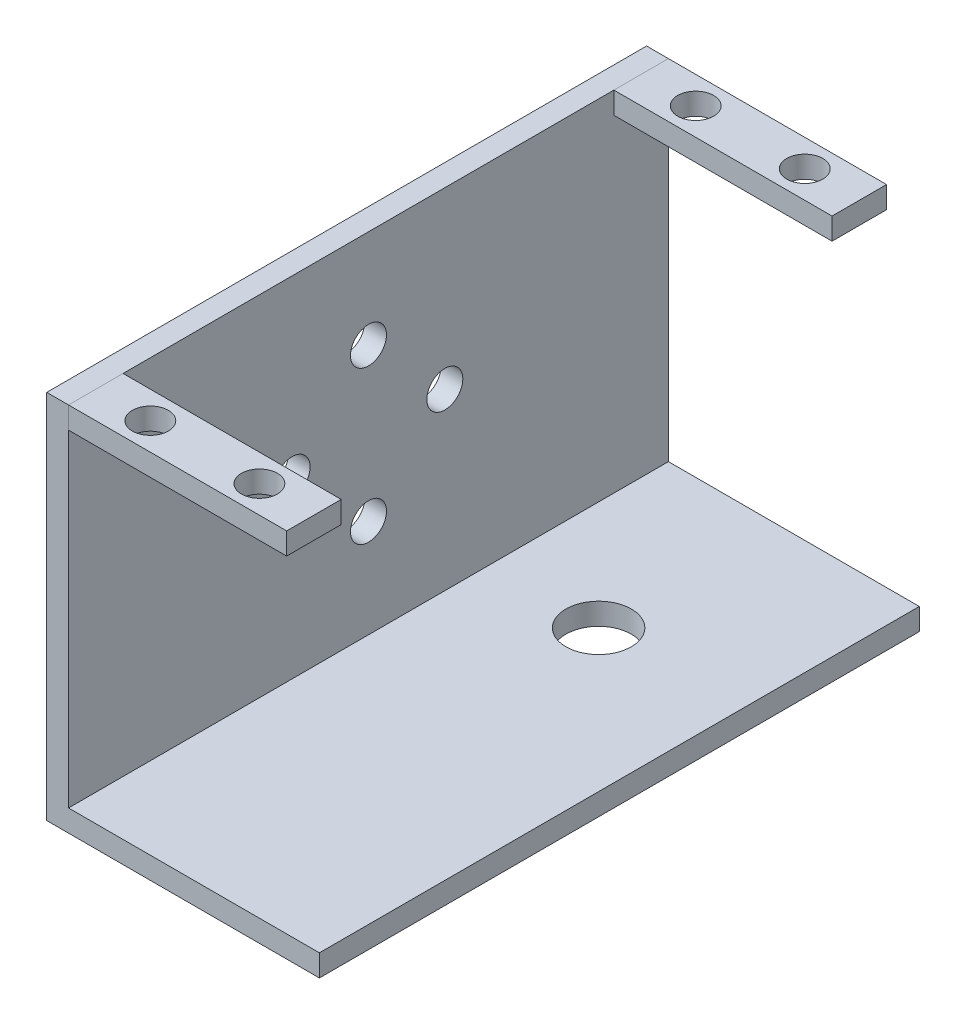
ISO-10303-21;
HEADER;
FILE_DESCRIPTION(('STEP AP214'),'2;1');
FILE_NAME('part.step','',(''),(''),'','','');
FILE_SCHEMA(('AUTOMOTIVE_DESIGN { 1 0 10303 214 1 1 1 1 }'));
ENDSEC;
DATA;
#1=APPLICATION_CONTEXT('core data for automotive mechanical design processes');
#2=APPLICATION_PROTOCOL_DEFINITION('international standard','automotive_design',2000,#1);
#3=PRODUCT_CONTEXT('',#1,'mechanical');
#4=PRODUCT('Part','Part','',(#3));
#5=PRODUCT_RELATED_PRODUCT_CATEGORY('part','',(#4));
#6=PRODUCT_DEFINITION_FORMATION('','',#4);
#7=PRODUCT_DEFINITION_CONTEXT('part definition',#1,'design');
#8=PRODUCT_DEFINITION('design','',#6,#7);
#9=PRODUCT_DEFINITION_SHAPE('','',#8);
#10=(LENGTH_UNIT() NAMED_UNIT(*) SI_UNIT(.MILLI.,.METRE.));
#11=(NAMED_UNIT(*) PLANE_ANGLE_UNIT() SI_UNIT($,.RADIAN.));
#12=(NAMED_UNIT(*) SI_UNIT($,.STERADIAN.) SOLID_ANGLE_UNIT());
#13=UNCERTAINTY_MEASURE_WITH_UNIT(LENGTH_MEASURE(1.E-05),#10,'distance_accuracy_value','');
#14=(GEOMETRIC_REPRESENTATION_CONTEXT(3) GLOBAL_UNCERTAINTY_ASSIGNED_CONTEXT((#13)) GLOBAL_UNIT_ASSIGNED_CONTEXT((#10,
#11,#12)) REPRESENTATION_CONTEXT('',''));
#15=CARTESIAN_POINT('',(0.,0.,0.));
#16=DIRECTION('',(0.,0.,1.));
#17=DIRECTION('',(1.,0.,0.));
#18=AXIS2_PLACEMENT_3D('',#15,#16,#17);
#19=CARTESIAN_POINT('',(9.49999999999993,32.,-22.5));
#20=DIRECTION('',(0.,0.,-1.));
#21=DIRECTION('',(0.,1.,0.));
#22=AXIS2_PLACEMENT_3D('',#19,#20,#21);
#23=PLANE('',#22);
#24=DIRECTION('',(0.,-1.,0.));
#25=VECTOR('',#24,1.);
#26=CARTESIAN_POINT('',(-10.5000000000001,32.,-22.5));
#27=LINE('',#26,#25);
#28=CARTESIAN_POINT('',(-10.5,34.,-22.5));
#29=VERTEX_POINT('',#28);
#30=CARTESIAN_POINT('',(-10.5000000000001,32.,-22.5));
#31=VERTEX_POINT('',#30);
#32=EDGE_CURVE('E122',#29,#31,#27,.T.);
#33=ORIENTED_EDGE('',*,*,#32,.T.);
#34=DIRECTION('',(-1.,0.,0.));
#35=VECTOR('',#34,1.);
#36=CARTESIAN_POINT('',(9.49999999999993,32.,-22.5));
#37=LINE('',#36,#35);
#38=CARTESIAN_POINT('',(9.49999999999993,32.,-22.5));
#39=VERTEX_POINT('',#38);
#40=EDGE_CURVE('E12',#39,#31,#37,.T.);
#41=ORIENTED_EDGE('',*,*,#40,.F.);
#42=DIRECTION('',(0.,-1.,0.));
#43=VECTOR('',#42,1.);
#44=CARTESIAN_POINT('',(9.49999999999993,32.,-22.5));
#45=LINE('',#44,#43);
#46=CARTESIAN_POINT('',(9.49999999999999,34.0000000000002,-22.5));
#47=VERTEX_POINT('',#46);
#48=EDGE_CURVE('E105',#47,#39,#45,.T.);
#49=ORIENTED_EDGE('',*,*,#48,.F.);
#50=DIRECTION('',(-1.,0.,0.));
#51=VECTOR('',#50,1.);
#52=CARTESIAN_POINT('',(9.49999999999999,34.0000000000002,-22.5));
#53=LINE('',#52,#51);
#54=EDGE_CURVE('E118',#47,#29,#53,.T.);
#55=ORIENTED_EDGE('',*,*,#54,.T.);
#56=EDGE_LOOP('',(#33,#41,#49,#55));
#57=FACE_BOUND('',#56,.T.);
#58=ADVANCED_FACE('F53',(#57),#23,.F.);
#59=CARTESIAN_POINT('',(9.49999999999993,32.,-22.5));
#60=DIRECTION('',(0.,1.,0.));
#61=DIRECTION('',(0.,0.,1.));
#62=AXIS2_PLACEMENT_3D('',#59,#60,#61);
#63=PLANE('',#62);
#64=CARTESIAN_POINT('',(4.49999999999993,32.,-25.));
#65=DIRECTION('',(0.,1.,0.));
#66=DIRECTION('',(0.,0.,1.));
#67=AXIS2_PLACEMENT_3D('',#64,#65,#66);
#68=CIRCLE('',#67,1.65);
#69=CARTESIAN_POINT('',(4.49999999999993,32.,-23.35));
#70=VERTEX_POINT('',#69);
#71=EDGE_CURVE('E126',#70,#70,#68,.F.);
#72=ORIENTED_EDGE('',*,*,#71,.F.);
#73=EDGE_LOOP('',(#72));
#74=FACE_BOUND('',#73,.T.);
#75=CARTESIAN_POINT('',(-5.50000000000007,32.,-25.));
#76=DIRECTION('',(0.,1.,0.));
#77=DIRECTION('',(0.,0.,1.));
#78=AXIS2_PLACEMENT_3D('',#75,#76,#77);
#79=CIRCLE('',#78,1.65);
#80=CARTESIAN_POINT('',(-5.50000000000007,32.,-23.35));
#81=VERTEX_POINT('',#80);
#82=EDGE_CURVE('E145',#81,#81,#79,.F.);
#83=ORIENTED_EDGE('',*,*,#82,.F.);
#84=EDGE_LOOP('',(#83));
#85=FACE_BOUND('',#84,.T.);
#86=DIRECTION('',(0.,0.,-1.));
#87=VECTOR('',#86,1.);
#88=CARTESIAN_POINT('',(-10.5000000000001,32.,-22.5));
#89=LINE('',#88,#87);
#90=CARTESIAN_POINT('',(-10.5,32.,-27.5));
#91=VERTEX_POINT('',#90);
#92=EDGE_CURVE('E110',#31,#91,#89,.T.);
#93=ORIENTED_EDGE('',*,*,#92,.T.);
#94=DIRECTION('',(-1.,0.,0.));
#95=VECTOR('',#94,1.);
#96=CARTESIAN_POINT('',(9.5,32.,-27.5));
#97=LINE('',#96,#95);
#98=CARTESIAN_POINT('',(9.5,32.,-27.5));
#99=VERTEX_POINT('',#98);
#100=EDGE_CURVE('E62',#99,#91,#97,.T.);
#101=ORIENTED_EDGE('',*,*,#100,.F.);
#102=DIRECTION('',(0.,0.,-1.));
#103=VECTOR('',#102,1.);
#104=CARTESIAN_POINT('',(9.49999999999993,32.,-22.5));
#105=LINE('',#104,#103);
#106=EDGE_CURVE('E100',#39,#99,#105,.T.);
#107=ORIENTED_EDGE('',*,*,#106,.F.);
#108=ORIENTED_EDGE('',*,*,#40,.T.);
#109=EDGE_LOOP('',(#93,#101,#107,#108));
#110=FACE_BOUND('',#109,.T.);
#111=ADVANCED_FACE('F109',(#74,#85,#110),#63,.F.);
#112=CARTESIAN_POINT('',(9.5,32.,-27.5));
#113=DIRECTION('',(0.,0.,1.));
#114=DIRECTION('',(1.,0.,0.));
#115=AXIS2_PLACEMENT_3D('',#112,#113,#114);
#116=PLANE('',#115);
#117=DIRECTION('',(0.,1.,0.));
#118=VECTOR('',#117,1.);
#119=CARTESIAN_POINT('',(-10.5,32.,-27.5));
#120=LINE('',#119,#118);
#121=CARTESIAN_POINT('',(-10.5,34.,-27.5));
#122=VERTEX_POINT('',#121);
#123=EDGE_CURVE('E87',#91,#122,#120,.T.);
#124=ORIENTED_EDGE('',*,*,#123,.T.);
#125=DIRECTION('',(-1.,0.,0.));
#126=VECTOR('',#125,1.);
#127=CARTESIAN_POINT('',(9.5,34.,-27.5));
#128=LINE('',#127,#126);
#129=CARTESIAN_POINT('',(9.5,34.,-27.5));
#130=VERTEX_POINT('',#129);
#131=EDGE_CURVE('E112',#130,#122,#128,.T.);
#132=ORIENTED_EDGE('',*,*,#131,.F.);
#133=DIRECTION('',(0.,1.,0.));
#134=VECTOR('',#133,1.);
#135=CARTESIAN_POINT('',(9.5,32.,-27.5));
#136=LINE('',#135,#134);
#137=EDGE_CURVE('E103',#99,#130,#136,.T.);
#138=ORIENTED_EDGE('',*,*,#137,.F.);
#139=ORIENTED_EDGE('',*,*,#100,.T.);
#140=EDGE_LOOP('',(#124,#132,#138,#139));
#141=FACE_BOUND('',#140,.T.);
#142=ADVANCED_FACE('F113',(#141),#116,.F.);
#143=CARTESIAN_POINT('',(9.49999999999999,34.0000000000002,-22.5));
#144=DIRECTION('',(0.,-1.,0.));
#145=DIRECTION('',(0.,0.,-1.));
#146=AXIS2_PLACEMENT_3D('',#143,#144,#145);
#147=PLANE('',#146);
#148=CARTESIAN_POINT('',(4.5,34.,-25.));
#149=DIRECTION('',(0.,1.,0.));
#150=DIRECTION('',(0.,0.,-1.));
#151=AXIS2_PLACEMENT_3D('',#148,#149,#150);
#152=CIRCLE('',#151,1.65);
#153=CARTESIAN_POINT('',(4.5,34.,-26.65));
#154=VERTEX_POINT('',#153);
#155=EDGE_CURVE('E149',#154,#154,#152,.T.);
#156=ORIENTED_EDGE('',*,*,#155,.F.);
#157=EDGE_LOOP('',(#156));
#158=FACE_BOUND('',#157,.T.);
#159=CARTESIAN_POINT('',(-5.5,34.,-25.));
#160=DIRECTION('',(0.,1.,0.));
#161=DIRECTION('',(0.,0.,-1.));
#162=AXIS2_PLACEMENT_3D('',#159,#160,#161);
#163=CIRCLE('',#162,1.65);
#164=CARTESIAN_POINT('',(-5.5,34.,-26.65));
#165=VERTEX_POINT('',#164);
#166=EDGE_CURVE('E150',#165,#165,#163,.T.);
#167=ORIENTED_EDGE('',*,*,#166,.F.);
#168=EDGE_LOOP('',(#167));
#169=FACE_BOUND('',#168,.T.);
#170=DIRECTION('',(0.,0.,1.));
#171=VECTOR('',#170,1.);
#172=CARTESIAN_POINT('',(-10.5,34.,-22.5));
#173=LINE('',#172,#171);
#174=EDGE_CURVE('E93',#122,#29,#173,.T.);
#175=ORIENTED_EDGE('',*,*,#174,.T.);
#176=ORIENTED_EDGE('',*,*,#54,.F.);
#177=DIRECTION('',(0.,0.,1.));
#178=VECTOR('',#177,1.);
#179=CARTESIAN_POINT('',(9.49999999999999,34.0000000000002,-22.5));
#180=LINE('',#179,#178);
#181=EDGE_CURVE('E70',#130,#47,#180,.T.);
#182=ORIENTED_EDGE('',*,*,#181,.F.);
#183=ORIENTED_EDGE('',*,*,#131,.T.);
#184=EDGE_LOOP('',(#175,#176,#182,#183));
#185=FACE_BOUND('',#184,.T.);
#186=ADVANCED_FACE('F137',(#158,#169,#185),#147,.F.);
#187=CARTESIAN_POINT('',(9.5,0.,0.));
#188=DIRECTION('',(-1.,0.,0.));
#189=DIRECTION('',(0.,0.,1.));
#190=AXIS2_PLACEMENT_3D('',#187,#188,#189);
#191=PLANE('',#190);
#192=ORIENTED_EDGE('',*,*,#48,.T.);
#193=ORIENTED_EDGE('',*,*,#106,.T.);
#194=ORIENTED_EDGE('',*,*,#137,.T.);
#195=ORIENTED_EDGE('',*,*,#181,.T.);
#196=EDGE_LOOP('',(#192,#193,#194,#195));
#197=FACE_BOUND('',#196,.T.);
#198=ADVANCED_FACE('F101',(#197),#191,.F.);
#199=CARTESIAN_POINT('',(-10.5,0.,0.));
#200=DIRECTION('',(-1.,0.,0.));
#201=DIRECTION('',(0.,0.,1.));
#202=AXIS2_PLACEMENT_3D('',#199,#200,#201);
#203=PLANE('',#202);
#204=ORIENTED_EDGE('',*,*,#32,.F.);
#205=ORIENTED_EDGE('',*,*,#174,.F.);
#206=ORIENTED_EDGE('',*,*,#123,.F.);
#207=ORIENTED_EDGE('',*,*,#92,.F.);
#208=EDGE_LOOP('',(#204,#205,#206,#207));
#209=FACE_BOUND('',#208,.T.);
#210=ADVANCED_FACE('F140',(#209),#203,.T.);
#211=CARTESIAN_POINT('',(-5.5,-0.000999999999924672,-25.));
#212=DIRECTION('',(0.,1.,0.));
#213=DIRECTION('',(0.,0.,1.));
#214=AXIS2_PLACEMENT_3D('',#211,#212,#213);
#215=CYLINDRICAL_SURFACE('',#214,1.65);
#216=ORIENTED_EDGE('',*,*,#166,.T.);
#217=EDGE_LOOP('',(#216));
#218=FACE_BOUND('',#217,.T.);
#219=ORIENTED_EDGE('',*,*,#82,.T.);
#220=EDGE_LOOP('',(#219));
#221=FACE_BOUND('',#220,.T.);
#222=ADVANCED_FACE('F170',(#218,#221),#215,.F.);
#223=CARTESIAN_POINT('',(4.5,-0.000999999999924672,-25.));
#224=DIRECTION('',(0.,1.,0.));
#225=DIRECTION('',(0.,0.,1.));
#226=AXIS2_PLACEMENT_3D('',#223,#224,#225);
#227=CYLINDRICAL_SURFACE('',#226,1.65);
#228=ORIENTED_EDGE('',*,*,#155,.T.);
#229=EDGE_LOOP('',(#228));
#230=FACE_BOUND('',#229,.T.);
#231=ORIENTED_EDGE('',*,*,#71,.T.);
#232=EDGE_LOOP('',(#231));
#233=FACE_BOUND('',#232,.T.);
#234=ADVANCED_FACE('F162',(#230,#233),#227,.F.);
#235=CLOSED_SHELL('',(#58,#111,#142,#186,#198,#210,#222,#234));
#236=MANIFOLD_SOLID_BREP('B2',#235);
#237=CARTESIAN_POINT('',(9.49999999999993,32.,22.4999999999999));
#238=DIRECTION('',(0.,0.,1.));
#239=DIRECTION('',(1.,0.,0.));
#240=AXIS2_PLACEMENT_3D('',#237,#238,#239);
#241=PLANE('',#240);
#242=DIRECTION('',(0.,1.,0.));
#243=VECTOR('',#242,1.);
#244=CARTESIAN_POINT('',(-10.5000000000001,32.,22.5));
#245=LINE('',#244,#243);
#246=CARTESIAN_POINT('',(-10.5000000000001,32.,22.5));
#247=VERTEX_POINT('',#246);
#248=CARTESIAN_POINT('',(-10.5,34.,22.5));
#249=VERTEX_POINT('',#248);
#250=EDGE_CURVE('E344',#247,#249,#245,.T.);
#251=ORIENTED_EDGE('',*,*,#250,.T.);
#252=DIRECTION('',(-1.,0.,0.));
#253=VECTOR('',#252,1.);
#254=CARTESIAN_POINT('',(9.5,34.,22.5));
#255=LINE('',#254,#253);
#256=CARTESIAN_POINT('',(9.5,34.,22.5));
#257=VERTEX_POINT('',#256);
#258=EDGE_CURVE('E51',#257,#249,#255,.T.);
#259=ORIENTED_EDGE('',*,*,#258,.F.);
#260=DIRECTION('',(0.,1.,0.));
#261=VECTOR('',#260,1.);
#262=CARTESIAN_POINT('',(9.49999999999993,32.,22.4999999999999));
#263=LINE('',#262,#261);
#264=CARTESIAN_POINT('',(9.49999999999993,32.,22.4999999999999));
#265=VERTEX_POINT('',#264);
#266=EDGE_CURVE('E327',#265,#257,#263,.T.);
#267=ORIENTED_EDGE('',*,*,#266,.F.);
#268=DIRECTION('',(-1.,0.,0.));
#269=VECTOR('',#268,1.);
#270=CARTESIAN_POINT('',(9.49999999999993,32.,22.4999999999999));
#271=LINE('',#270,#269);
#272=EDGE_CURVE('E340',#265,#247,#271,.T.);
#273=ORIENTED_EDGE('',*,*,#272,.T.);
#274=EDGE_LOOP('',(#251,#259,#267,#273));
#275=FACE_BOUND('',#274,.T.);
#276=ADVANCED_FACE('F275',(#275),#241,.F.);
#277=CARTESIAN_POINT('',(9.5,34.,22.5));
#278=DIRECTION('',(0.,-1.,0.));
#279=DIRECTION('',(0.,0.,-1.));
#280=AXIS2_PLACEMENT_3D('',#277,#278,#279);
#281=PLANE('',#280);
#282=CARTESIAN_POINT('',(-5.5,34.,25.));
#283=DIRECTION('',(0.,1.,0.));
#284=DIRECTION('',(0.,0.,1.));
#285=AXIS2_PLACEMENT_3D('',#282,#283,#284);
#286=CIRCLE('',#285,1.65);
#287=CARTESIAN_POINT('',(-5.5,34.,26.65));
#288=VERTEX_POINT('',#287);
#289=EDGE_CURVE('E371',#288,#288,#286,.T.);
#290=ORIENTED_EDGE('',*,*,#289,.F.);
#291=EDGE_LOOP('',(#290));
#292=FACE_BOUND('',#291,.T.);
#293=CARTESIAN_POINT('',(4.5,34.,25.));
#294=DIRECTION('',(0.,1.,0.));
#295=DIRECTION('',(0.,0.,1.));
#296=AXIS2_PLACEMENT_3D('',#293,#294,#295);
#297=CIRCLE('',#296,1.65);
#298=CARTESIAN_POINT('',(4.5,34.,26.65));
#299=VERTEX_POINT('',#298);
#300=EDGE_CURVE('E372',#299,#299,#297,.T.);
#301=ORIENTED_EDGE('',*,*,#300,.F.);
#302=EDGE_LOOP('',(#301));
#303=FACE_BOUND('',#302,.T.);
#304=DIRECTION('',(0.,0.,1.));
#305=VECTOR('',#304,1.);
#306=CARTESIAN_POINT('',(-10.5,34.,22.5));
#307=LINE('',#306,#305);
#308=CARTESIAN_POINT('',(-10.5,34.,27.5));
#309=VERTEX_POINT('',#308);
#310=EDGE_CURVE('E332',#249,#309,#307,.T.);
#311=ORIENTED_EDGE('',*,*,#310,.T.);
#312=DIRECTION('',(-1.,0.,0.));
#313=VECTOR('',#312,1.);
#314=CARTESIAN_POINT('',(9.50000000000001,34.,27.5));
#315=LINE('',#314,#313);
#316=CARTESIAN_POINT('',(9.50000000000001,34.,27.5));
#317=VERTEX_POINT('',#316);
#318=EDGE_CURVE('E284',#317,#309,#315,.T.);
#319=ORIENTED_EDGE('',*,*,#318,.F.);
#320=DIRECTION('',(0.,0.,1.));
#321=VECTOR('',#320,1.);
#322=CARTESIAN_POINT('',(9.5,34.,22.5));
#323=LINE('',#322,#321);
#324=EDGE_CURVE('E322',#257,#317,#323,.T.);
#325=ORIENTED_EDGE('',*,*,#324,.F.);
#326=ORIENTED_EDGE('',*,*,#258,.T.);
#327=EDGE_LOOP('',(#311,#319,#325,#326));
#328=FACE_BOUND('',#327,.T.);
#329=ADVANCED_FACE('F331',(#292,#303,#328),#281,.F.);
#330=CARTESIAN_POINT('',(9.5,32.0000000000001,27.5));
#331=DIRECTION('',(0.,0.,-1.));
#332=DIRECTION('',(-1.,0.,0.));
#333=AXIS2_PLACEMENT_3D('',#330,#331,#332);
#334=PLANE('',#333);
#335=DIRECTION('',(0.,-1.,0.));
#336=VECTOR('',#335,1.);
#337=CARTESIAN_POINT('',(-10.5,32.,27.5));
#338=LINE('',#337,#336);
#339=CARTESIAN_POINT('',(-10.5,32.,27.5));
#340=VERTEX_POINT('',#339);
#341=EDGE_CURVE('E309',#309,#340,#338,.T.);
#342=ORIENTED_EDGE('',*,*,#341,.T.);
#343=DIRECTION('',(-1.,0.,0.));
#344=VECTOR('',#343,1.);
#345=CARTESIAN_POINT('',(9.5,32.0000000000001,27.5));
#346=LINE('',#345,#344);
#347=CARTESIAN_POINT('',(9.5,32.0000000000001,27.5));
#348=VERTEX_POINT('',#347);
#349=EDGE_CURVE('E334',#348,#340,#346,.T.);
#350=ORIENTED_EDGE('',*,*,#349,.F.);
#351=DIRECTION('',(0.,-1.,0.));
#352=VECTOR('',#351,1.);
#353=CARTESIAN_POINT('',(9.5,32.0000000000001,27.5));
#354=LINE('',#353,#352);
#355=EDGE_CURVE('E325',#317,#348,#354,.T.);
#356=ORIENTED_EDGE('',*,*,#355,.F.);
#357=ORIENTED_EDGE('',*,*,#318,.T.);
#358=EDGE_LOOP('',(#342,#350,#356,#357));
#359=FACE_BOUND('',#358,.T.);
#360=ADVANCED_FACE('F335',(#359),#334,.F.);
#361=CARTESIAN_POINT('',(9.49999999999993,32.,22.4999999999999));
#362=DIRECTION('',(0.,1.,0.));
#363=DIRECTION('',(0.,0.,1.));
#364=AXIS2_PLACEMENT_3D('',#361,#362,#363);
#365=PLANE('',#364);
#366=CARTESIAN_POINT('',(-5.5,32.0000000000002,25.));
#367=DIRECTION('',(0.,1.,0.));
#368=DIRECTION('',(0.,0.,1.));
#369=AXIS2_PLACEMENT_3D('',#366,#367,#368);
#370=CIRCLE('',#369,1.65);
#371=CARTESIAN_POINT('',(-5.5,32.0000000000002,26.65));
#372=VERTEX_POINT('',#371);
#373=EDGE_CURVE('E348',#372,#372,#370,.F.);
#374=ORIENTED_EDGE('',*,*,#373,.F.);
#375=EDGE_LOOP('',(#374));
#376=FACE_BOUND('',#375,.T.);
#377=CARTESIAN_POINT('',(4.5,32.0000000000001,24.9999999999999));
#378=DIRECTION('',(0.,1.,0.));
#379=DIRECTION('',(0.,0.,1.));
#380=AXIS2_PLACEMENT_3D('',#377,#378,#379);
#381=CIRCLE('',#380,1.65);
#382=CARTESIAN_POINT('',(4.5,32.0000000000001,26.6499999999999));
#383=VERTEX_POINT('',#382);
#384=EDGE_CURVE('E367',#383,#383,#381,.F.);
#385=ORIENTED_EDGE('',*,*,#384,.F.);
#386=EDGE_LOOP('',(#385));
#387=FACE_BOUND('',#386,.T.);
#388=DIRECTION('',(0.,0.,-1.));
#389=VECTOR('',#388,1.);
#390=CARTESIAN_POINT('',(-10.5000000000001,32.,22.5));
#391=LINE('',#390,#389);
#392=EDGE_CURVE('E315',#340,#247,#391,.T.);
#393=ORIENTED_EDGE('',*,*,#392,.T.);
#394=ORIENTED_EDGE('',*,*,#272,.F.);
#395=DIRECTION('',(0.,0.,-1.));
#396=VECTOR('',#395,1.);
#397=CARTESIAN_POINT('',(9.49999999999993,32.,22.4999999999999));
#398=LINE('',#397,#396);
#399=EDGE_CURVE('E292',#348,#265,#398,.T.);
#400=ORIENTED_EDGE('',*,*,#399,.F.);
#401=ORIENTED_EDGE('',*,*,#349,.T.);
#402=EDGE_LOOP('',(#393,#394,#400,#401));
#403=FACE_BOUND('',#402,.T.);
#404=ADVANCED_FACE('F359',(#376,#387,#403),#365,.F.);
#405=CARTESIAN_POINT('',(9.50000000000001,0.,0.));
#406=DIRECTION('',(1.,0.,0.));
#407=DIRECTION('',(0.,0.,-1.));
#408=AXIS2_PLACEMENT_3D('',#405,#406,#407);
#409=PLANE('',#408);
#410=ORIENTED_EDGE('',*,*,#266,.T.);
#411=ORIENTED_EDGE('',*,*,#324,.T.);
#412=ORIENTED_EDGE('',*,*,#355,.T.);
#413=ORIENTED_EDGE('',*,*,#399,.T.);
#414=EDGE_LOOP('',(#410,#411,#412,#413));
#415=FACE_BOUND('',#414,.T.);
#416=ADVANCED_FACE('F323',(#415),#409,.T.);
#417=CARTESIAN_POINT('',(-10.5,0.,0.));
#418=DIRECTION('',(1.,0.,0.));
#419=DIRECTION('',(0.,0.,-1.));
#420=AXIS2_PLACEMENT_3D('',#417,#418,#419);
#421=PLANE('',#420);
#422=ORIENTED_EDGE('',*,*,#250,.F.);
#423=ORIENTED_EDGE('',*,*,#392,.F.);
#424=ORIENTED_EDGE('',*,*,#341,.F.);
#425=ORIENTED_EDGE('',*,*,#310,.F.);
#426=EDGE_LOOP('',(#422,#423,#424,#425));
#427=FACE_BOUND('',#426,.T.);
#428=ADVANCED_FACE('F362',(#427),#421,.F.);
#429=CARTESIAN_POINT('',(4.5,-0.000999999999924672,25.));
#430=DIRECTION('',(0.,1.,0.));
#431=DIRECTION('',(0.,0.,1.));
#432=AXIS2_PLACEMENT_3D('',#429,#430,#431);
#433=CYLINDRICAL_SURFACE('',#432,1.65);
#434=ORIENTED_EDGE('',*,*,#300,.T.);
#435=EDGE_LOOP('',(#434));
#436=FACE_BOUND('',#435,.T.);
#437=ORIENTED_EDGE('',*,*,#384,.T.);
#438=EDGE_LOOP('',(#437));
#439=FACE_BOUND('',#438,.T.);
#440=ADVANCED_FACE('F391',(#436,#439),#433,.F.);
#441=CARTESIAN_POINT('',(-5.5,-0.000999999999924672,25.));
#442=DIRECTION('',(0.,1.,0.));
#443=DIRECTION('',(0.,0.,1.));
#444=AXIS2_PLACEMENT_3D('',#441,#442,#443);
#445=CYLINDRICAL_SURFACE('',#444,1.65);
#446=ORIENTED_EDGE('',*,*,#289,.T.);
#447=EDGE_LOOP('',(#446));
#448=FACE_BOUND('',#447,.T.);
#449=ORIENTED_EDGE('',*,*,#373,.T.);
#450=EDGE_LOOP('',(#449));
#451=FACE_BOUND('',#450,.T.);
#452=ADVANCED_FACE('F384',(#448,#451),#445,.F.);
#453=CLOSED_SHELL('',(#276,#329,#360,#404,#416,#428,#440,#452));
#454=MANIFOLD_SOLID_BREP('B6',#453);
#455=CARTESIAN_POINT('',(0.,2.,0.));
#456=DIRECTION('',(0.,-1.,0.));
#457=DIRECTION('',(0.,0.,-1.));
#458=AXIS2_PLACEMENT_3D('',#455,#456,#457);
#459=PLANE('',#458);
#460=CARTESIAN_POINT('',(-0.499999999999994,2.00000000000008,-11.1));
#461=DIRECTION('',(0.,1.,0.));
#462=DIRECTION('',(0.,0.,1.));
#463=AXIS2_PLACEMENT_3D('',#460,#461,#462);
#464=CIRCLE('',#463,3.);
#465=CARTESIAN_POINT('',(-0.499999999999994,2.00000000000008,-8.09999999999999));
#466=VERTEX_POINT('',#465);
#467=EDGE_CURVE('E660',#466,#466,#464,.T.);
#468=ORIENTED_EDGE('',*,*,#467,.F.);
#469=EDGE_LOOP('',(#468));
#470=FACE_BOUND('',#469,.T.);
#471=DIRECTION('',(0.,0.,-1.));
#472=VECTOR('',#471,1.);
#473=CARTESIAN_POINT('',(-10.5,2.00000000000015,-27.5));
#474=LINE('',#473,#472);
#475=CARTESIAN_POINT('',(-10.5,2.,27.5));
#476=VERTEX_POINT('',#475);
#477=CARTESIAN_POINT('',(-10.5,2.00000000000015,-27.5));
#478=VERTEX_POINT('',#477);
#479=EDGE_CURVE('E505',#476,#478,#474,.T.);
#480=ORIENTED_EDGE('',*,*,#479,.F.);
#481=DIRECTION('',(1.,0.,0.));
#482=VECTOR('',#481,1.);
#483=CARTESIAN_POINT('',(-12.5,2.,27.5));
#484=LINE('',#483,#482);
#485=CARTESIAN_POINT('',(12.5,2.,27.5));
#486=VERTEX_POINT('',#485);
#487=EDGE_CURVE('E510',#476,#486,#484,.T.);
#488=ORIENTED_EDGE('',*,*,#487,.T.);
#489=DIRECTION('',(0.,0.,-1.));
#490=VECTOR('',#489,1.);
#491=CARTESIAN_POINT('',(12.5,2.,27.5));
#492=LINE('',#491,#490);
#493=CARTESIAN_POINT('',(12.5,2.00000000000008,-27.5));
#494=VERTEX_POINT('',#493);
#495=EDGE_CURVE('E542',#486,#494,#492,.T.);
#496=ORIENTED_EDGE('',*,*,#495,.T.);
#497=DIRECTION('',(-1.,0.,0.));
#498=VECTOR('',#497,1.);
#499=CARTESIAN_POINT('',(-12.5,2.00000000000008,-27.5));
#500=LINE('',#499,#498);
#501=EDGE_CURVE('E609',#494,#478,#500,.T.);
#502=ORIENTED_EDGE('',*,*,#501,.T.);
#503=EDGE_LOOP('',(#480,#488,#496,#502));
#504=FACE_BOUND('',#503,.T.);
#505=ADVANCED_FACE('F488',(#470,#504),#459,.F.);
#506=CARTESIAN_POINT('',(12.5,2.,27.5));
#507=DIRECTION('',(-1.,0.,0.));
#508=DIRECTION('',(0.,0.,1.));
#509=AXIS2_PLACEMENT_3D('',#506,#507,#508);
#510=PLANE('',#509);
#511=DIRECTION('',(0.,0.,-1.));
#512=VECTOR('',#511,1.);
#513=CARTESIAN_POINT('',(12.5,0.,27.5));
#514=LINE('',#513,#512);
#515=CARTESIAN_POINT('',(12.5,0.,27.5));
#516=VERTEX_POINT('',#515);
#517=CARTESIAN_POINT('',(12.5,0.,-27.5));
#518=VERTEX_POINT('',#517);
#519=EDGE_CURVE('E548',#516,#518,#514,.T.);
#520=ORIENTED_EDGE('',*,*,#519,.T.);
#521=DIRECTION('',(0.,-1.,0.));
#522=VECTOR('',#521,1.);
#523=CARTESIAN_POINT('',(12.5,2.00000000000008,-27.5));
#524=LINE('',#523,#522);
#525=EDGE_CURVE('E273',#494,#518,#524,.T.);
#526=ORIENTED_EDGE('',*,*,#525,.F.);
#527=ORIENTED_EDGE('',*,*,#495,.F.);
#528=DIRECTION('',(0.,-1.,0.));
#529=VECTOR('',#528,1.);
#530=CARTESIAN_POINT('',(12.5,2.,27.5));
#531=LINE('',#530,#529);
#532=EDGE_CURVE('E533',#486,#516,#531,.T.);
#533=ORIENTED_EDGE('',*,*,#532,.T.);
#534=EDGE_LOOP('',(#520,#526,#527,#533));
#535=FACE_BOUND('',#534,.T.);
#536=ADVANCED_FACE('F490',(#535),#510,.F.);
#537=CARTESIAN_POINT('',(-12.5,2.00000000000008,-27.5));
#538=DIRECTION('',(0.,0.,1.));
#539=DIRECTION('',(1.,0.,0.));
#540=AXIS2_PLACEMENT_3D('',#537,#538,#539);
#541=PLANE('',#540);
#542=DIRECTION('',(-1.,0.,0.));
#543=VECTOR('',#542,1.);
#544=CARTESIAN_POINT('',(-12.5,0.,-27.5));
#545=LINE('',#544,#543);
#546=CARTESIAN_POINT('',(-12.5,0.,-27.5));
#547=VERTEX_POINT('',#546);
#548=EDGE_CURVE('E552',#518,#547,#545,.T.);
#549=ORIENTED_EDGE('',*,*,#548,.T.);
#550=DIRECTION('',(0.,-1.,0.));
#551=VECTOR('',#550,1.);
#552=CARTESIAN_POINT('',(-12.5,2.00000000000008,-27.5));
#553=LINE('',#552,#551);
#554=CARTESIAN_POINT('',(-12.5,34.,-27.5));
#555=VERTEX_POINT('',#554);
#556=EDGE_CURVE('E498',#555,#547,#553,.T.);
#557=ORIENTED_EDGE('',*,*,#556,.F.);
#558=DIRECTION('',(-1.,0.,0.));
#559=VECTOR('',#558,1.);
#560=CARTESIAN_POINT('',(-12.5,34.,-27.5));
#561=LINE('',#560,#559);
#562=CARTESIAN_POINT('',(-10.5,34.,-27.5));
#563=VERTEX_POINT('',#562);
#564=EDGE_CURVE('E585',#563,#555,#561,.T.);
#565=ORIENTED_EDGE('',*,*,#564,.F.);
#566=DIRECTION('',(0.,-1.,0.));
#567=VECTOR('',#566,1.);
#568=CARTESIAN_POINT('',(-10.5,34.,-27.5));
#569=LINE('',#568,#567);
#570=EDGE_CURVE('E561',#563,#478,#569,.T.);
#571=ORIENTED_EDGE('',*,*,#570,.T.);
#572=ORIENTED_EDGE('',*,*,#501,.F.);
#573=ORIENTED_EDGE('',*,*,#525,.T.);
#574=EDGE_LOOP('',(#549,#557,#565,#571,#572,#573));
#575=FACE_BOUND('',#574,.T.);
#576=ADVANCED_FACE('F582',(#575),#541,.F.);
#577=CARTESIAN_POINT('',(-12.5,2.,27.5));
#578=DIRECTION('',(1.,0.,0.));
#579=DIRECTION('',(0.,0.,-1.));
#580=AXIS2_PLACEMENT_3D('',#577,#578,#579);
#581=PLANE('',#580);
#582=CARTESIAN_POINT('',(-12.4999999999999,18.,7.));
#583=DIRECTION('',(1.,0.,0.));
#584=DIRECTION('',(0.,0.,-1.));
#585=AXIS2_PLACEMENT_3D('',#582,#583,#584);
#586=CIRCLE('',#585,1.65);
#587=CARTESIAN_POINT('',(-12.4999999999999,18.,5.35));
#588=VERTEX_POINT('',#587);
#589=EDGE_CURVE('E606',#588,#588,#586,.T.);
#590=ORIENTED_EDGE('',*,*,#589,.T.);
#591=EDGE_LOOP('',(#590));
#592=FACE_BOUND('',#591,.T.);
#593=CARTESIAN_POINT('',(-12.5,18.0000000000001,-7.));
#594=DIRECTION('',(1.,0.,0.));
#595=DIRECTION('',(0.,0.,-1.));
#596=AXIS2_PLACEMENT_3D('',#593,#594,#595);
#597=CIRCLE('',#596,1.65);
#598=CARTESIAN_POINT('',(-12.5,18.0000000000001,-8.65));
#599=VERTEX_POINT('',#598);
#600=EDGE_CURVE('E632',#599,#599,#597,.T.);
#601=ORIENTED_EDGE('',*,*,#600,.T.);
#602=EDGE_LOOP('',(#601));
#603=FACE_BOUND('',#602,.T.);
#604=CARTESIAN_POINT('',(-12.5,25.0000000000001,0.));
#605=DIRECTION('',(1.,0.,0.));
#606=DIRECTION('',(0.,0.,-1.));
#607=AXIS2_PLACEMENT_3D('',#604,#605,#606);
#608=CIRCLE('',#607,1.65);
#609=CARTESIAN_POINT('',(-12.5,25.0000000000001,-1.65000000000001));
#610=VERTEX_POINT('',#609);
#611=EDGE_CURVE('E636',#610,#610,#608,.T.);
#612=ORIENTED_EDGE('',*,*,#611,.T.);
#613=EDGE_LOOP('',(#612));
#614=FACE_BOUND('',#613,.T.);
#615=CARTESIAN_POINT('',(-12.5,11.0000000000001,0.));
#616=DIRECTION('',(1.,0.,0.));
#617=DIRECTION('',(0.,0.,-1.));
#618=AXIS2_PLACEMENT_3D('',#615,#616,#617);
#619=CIRCLE('',#618,1.65);
#620=CARTESIAN_POINT('',(-12.5,11.0000000000001,-1.65));
#621=VERTEX_POINT('',#620);
#622=EDGE_CURVE('E640',#621,#621,#619,.T.);
#623=ORIENTED_EDGE('',*,*,#622,.T.);
#624=EDGE_LOOP('',(#623));
#625=FACE_BOUND('',#624,.T.);
#626=DIRECTION('',(0.,0.,1.));
#627=VECTOR('',#626,1.);
#628=CARTESIAN_POINT('',(-12.5,0.,27.5));
#629=LINE('',#628,#627);
#630=CARTESIAN_POINT('',(-12.5,0.,27.5));
#631=VERTEX_POINT('',#630);
#632=EDGE_CURVE('E543',#547,#631,#629,.T.);
#633=ORIENTED_EDGE('',*,*,#632,.T.);
#634=DIRECTION('',(0.,-1.,0.));
#635=VECTOR('',#634,1.);
#636=CARTESIAN_POINT('',(-12.5,2.,27.5));
#637=LINE('',#636,#635);
#638=CARTESIAN_POINT('',(-12.5,34.,27.5));
#639=VERTEX_POINT('',#638);
#640=EDGE_CURVE('E537',#639,#631,#637,.T.);
#641=ORIENTED_EDGE('',*,*,#640,.F.);
#642=DIRECTION('',(0.,0.,1.));
#643=VECTOR('',#642,1.);
#644=CARTESIAN_POINT('',(-12.5,34.,-27.5));
#645=LINE('',#644,#643);
#646=EDGE_CURVE('E578',#555,#639,#645,.T.);
#647=ORIENTED_EDGE('',*,*,#646,.F.);
#648=ORIENTED_EDGE('',*,*,#556,.T.);
#649=EDGE_LOOP('',(#633,#641,#647,#648));
#650=FACE_BOUND('',#649,.T.);
#651=ADVANCED_FACE('F576',(#592,#603,#614,#625,#650),#581,.F.);
#652=CARTESIAN_POINT('',(-12.5,2.,27.5));
#653=DIRECTION('',(0.,0.,-1.));
#654=DIRECTION('',(-1.,0.,0.));
#655=AXIS2_PLACEMENT_3D('',#652,#653,#654);
#656=PLANE('',#655);
#657=DIRECTION('',(1.,0.,0.));
#658=VECTOR('',#657,1.);
#659=CARTESIAN_POINT('',(-12.5,0.,27.5));
#660=LINE('',#659,#658);
#661=EDGE_CURVE('E530',#631,#516,#660,.T.);
#662=ORIENTED_EDGE('',*,*,#661,.T.);
#663=ORIENTED_EDGE('',*,*,#532,.F.);
#664=ORIENTED_EDGE('',*,*,#487,.F.);
#665=DIRECTION('',(0.,-1.,0.));
#666=VECTOR('',#665,1.);
#667=CARTESIAN_POINT('',(-10.5,34.,27.5));
#668=LINE('',#667,#666);
#669=CARTESIAN_POINT('',(-10.5,34.,27.5));
#670=VERTEX_POINT('',#669);
#671=EDGE_CURVE('E554',#670,#476,#668,.T.);
#672=ORIENTED_EDGE('',*,*,#671,.F.);
#673=DIRECTION('',(1.,0.,0.));
#674=VECTOR('',#673,1.);
#675=CARTESIAN_POINT('',(-12.5,34.,27.5));
#676=LINE('',#675,#674);
#677=EDGE_CURVE('E601',#639,#670,#676,.T.);
#678=ORIENTED_EDGE('',*,*,#677,.F.);
#679=ORIENTED_EDGE('',*,*,#640,.T.);
#680=EDGE_LOOP('',(#662,#663,#664,#672,#678,#679));
#681=FACE_BOUND('',#680,.T.);
#682=ADVANCED_FACE('F532',(#681),#656,.F.);
#683=CARTESIAN_POINT('',(0.,0.,0.));
#684=DIRECTION('',(0.,-1.,0.));
#685=DIRECTION('',(0.,0.,-1.));
#686=AXIS2_PLACEMENT_3D('',#683,#684,#685);
#687=PLANE('',#686);
#688=CARTESIAN_POINT('',(-0.5,0.,-11.1));
#689=DIRECTION('',(0.,-1.,0.));
#690=DIRECTION('',(0.,0.,-1.));
#691=AXIS2_PLACEMENT_3D('',#688,#689,#690);
#692=CIRCLE('',#691,3.);
#693=CARTESIAN_POINT('',(-0.5,0.,-14.1));
#694=VERTEX_POINT('',#693);
#695=EDGE_CURVE('E492',#694,#694,#692,.T.);
#696=ORIENTED_EDGE('',*,*,#695,.F.);
#697=EDGE_LOOP('',(#696));
#698=FACE_BOUND('',#697,.T.);
#699=ORIENTED_EDGE('',*,*,#519,.F.);
#700=ORIENTED_EDGE('',*,*,#661,.F.);
#701=ORIENTED_EDGE('',*,*,#632,.F.);
#702=ORIENTED_EDGE('',*,*,#548,.F.);
#703=EDGE_LOOP('',(#699,#700,#701,#702));
#704=FACE_BOUND('',#703,.T.);
#705=ADVANCED_FACE('F551',(#698,#704),#687,.T.);
#706=CARTESIAN_POINT('',(-10.5,34.,-27.5));
#707=DIRECTION('',(-1.,0.,0.));
#708=DIRECTION('',(0.,0.,1.));
#709=AXIS2_PLACEMENT_3D('',#706,#707,#708);
#710=PLANE('',#709);
#711=CARTESIAN_POINT('',(-10.4999999999999,18.,7.));
#712=DIRECTION('',(1.,0.,0.));
#713=DIRECTION('',(0.,0.,-1.));
#714=AXIS2_PLACEMENT_3D('',#711,#712,#713);
#715=CIRCLE('',#714,1.65);
#716=CARTESIAN_POINT('',(-10.4999999999999,18.,5.35));
#717=VERTEX_POINT('',#716);
#718=EDGE_CURVE('E644',#717,#717,#715,.T.);
#719=ORIENTED_EDGE('',*,*,#718,.F.);
#720=EDGE_LOOP('',(#719));
#721=FACE_BOUND('',#720,.T.);
#722=CARTESIAN_POINT('',(-10.5,18.0000000000002,-7.));
#723=DIRECTION('',(1.,0.,0.));
#724=DIRECTION('',(0.,0.,-1.));
#725=AXIS2_PLACEMENT_3D('',#722,#723,#724);
#726=CIRCLE('',#725,1.65);
#727=CARTESIAN_POINT('',(-10.5,18.0000000000002,-8.65));
#728=VERTEX_POINT('',#727);
#729=EDGE_CURVE('E653',#728,#728,#726,.T.);
#730=ORIENTED_EDGE('',*,*,#729,.F.);
#731=EDGE_LOOP('',(#730));
#732=FACE_BOUND('',#731,.T.);
#733=CARTESIAN_POINT('',(-10.5,25.0000000000002,0.));
#734=DIRECTION('',(1.,0.,0.));
#735=DIRECTION('',(0.,0.,-1.));
#736=AXIS2_PLACEMENT_3D('',#733,#734,#735);
#737=CIRCLE('',#736,1.65);
#738=CARTESIAN_POINT('',(-10.5,25.0000000000002,-1.65));
#739=VERTEX_POINT('',#738);
#740=EDGE_CURVE('E649',#739,#739,#737,.T.);
#741=ORIENTED_EDGE('',*,*,#740,.F.);
#742=EDGE_LOOP('',(#741));
#743=FACE_BOUND('',#742,.T.);
#744=CARTESIAN_POINT('',(-10.5,11.0000000000002,0.));
#745=DIRECTION('',(1.,0.,0.));
#746=DIRECTION('',(0.,0.,-1.));
#747=AXIS2_PLACEMENT_3D('',#744,#745,#746);
#748=CIRCLE('',#747,1.65);
#749=CARTESIAN_POINT('',(-10.5,11.0000000000002,-1.65000000000001));
#750=VERTEX_POINT('',#749);
#751=EDGE_CURVE('E645',#750,#750,#748,.T.);
#752=ORIENTED_EDGE('',*,*,#751,.F.);
#753=EDGE_LOOP('',(#752));
#754=FACE_BOUND('',#753,.T.);
#755=ORIENTED_EDGE('',*,*,#479,.T.);
#756=ORIENTED_EDGE('',*,*,#570,.F.);
#757=DIRECTION('',(0.,0.,-1.));
#758=VECTOR('',#757,1.);
#759=CARTESIAN_POINT('',(-10.5,34.,-27.5));
#760=LINE('',#759,#758);
#761=EDGE_CURVE('E593',#670,#563,#760,.T.);
#762=ORIENTED_EDGE('',*,*,#761,.F.);
#763=ORIENTED_EDGE('',*,*,#671,.T.);
#764=EDGE_LOOP('',(#755,#756,#762,#763));
#765=FACE_BOUND('',#764,.T.);
#766=ADVANCED_FACE('F618',(#721,#732,#743,#754,#765),#710,.F.);
#767=CARTESIAN_POINT('',(0.,34.0000000000002,0.));
#768=DIRECTION('',(0.,1.,0.));
#769=DIRECTION('',(0.,0.,1.));
#770=AXIS2_PLACEMENT_3D('',#767,#768,#769);
#771=PLANE('',#770);
#772=ORIENTED_EDGE('',*,*,#646,.T.);
#773=ORIENTED_EDGE('',*,*,#677,.T.);
#774=ORIENTED_EDGE('',*,*,#761,.T.);
#775=ORIENTED_EDGE('',*,*,#564,.T.);
#776=EDGE_LOOP('',(#772,#773,#774,#775));
#777=FACE_BOUND('',#776,.T.);
#778=ADVANCED_FACE('F589',(#777),#771,.T.);
#779=CARTESIAN_POINT('',(-20.5,11.0000000000001,0.));
#780=DIRECTION('',(1.,0.,0.));
#781=DIRECTION('',(0.,0.,-1.));
#782=AXIS2_PLACEMENT_3D('',#779,#780,#781);
#783=CYLINDRICAL_SURFACE('',#782,1.65);
#784=ORIENTED_EDGE('',*,*,#751,.T.);
#785=EDGE_LOOP('',(#784));
#786=FACE_BOUND('',#785,.T.);
#787=ORIENTED_EDGE('',*,*,#622,.F.);
#788=EDGE_LOOP('',(#787));
#789=FACE_BOUND('',#788,.T.);
#790=ADVANCED_FACE('F691',(#786,#789),#783,.F.);
#791=CARTESIAN_POINT('',(-20.5,25.0000000000001,0.));
#792=DIRECTION('',(1.,0.,0.));
#793=DIRECTION('',(0.,0.,-1.));
#794=AXIS2_PLACEMENT_3D('',#791,#792,#793);
#795=CYLINDRICAL_SURFACE('',#794,1.65);
#796=ORIENTED_EDGE('',*,*,#740,.T.);
#797=EDGE_LOOP('',(#796));
#798=FACE_BOUND('',#797,.T.);
#799=ORIENTED_EDGE('',*,*,#611,.F.);
#800=EDGE_LOOP('',(#799));
#801=FACE_BOUND('',#800,.T.);
#802=ADVANCED_FACE('F694',(#798,#801),#795,.F.);
#803=CARTESIAN_POINT('',(-20.5,18.0000000000001,-7.));
#804=DIRECTION('',(1.,0.,0.));
#805=DIRECTION('',(0.,0.,-1.));
#806=AXIS2_PLACEMENT_3D('',#803,#804,#805);
#807=CYLINDRICAL_SURFACE('',#806,1.65);
#808=ORIENTED_EDGE('',*,*,#729,.T.);
#809=EDGE_LOOP('',(#808));
#810=FACE_BOUND('',#809,.T.);
#811=ORIENTED_EDGE('',*,*,#600,.F.);
#812=EDGE_LOOP('',(#811));
#813=FACE_BOUND('',#812,.T.);
#814=ADVANCED_FACE('F698',(#810,#813),#807,.F.);
#815=CARTESIAN_POINT('',(-20.5,18.0000000000001,7.00000000000001));
#816=DIRECTION('',(1.,0.,0.));
#817=DIRECTION('',(0.,0.,-1.));
#818=AXIS2_PLACEMENT_3D('',#815,#816,#817);
#819=CYLINDRICAL_SURFACE('',#818,1.65);
#820=ORIENTED_EDGE('',*,*,#718,.T.);
#821=EDGE_LOOP('',(#820));
#822=FACE_BOUND('',#821,.T.);
#823=ORIENTED_EDGE('',*,*,#589,.F.);
#824=EDGE_LOOP('',(#823));
#825=FACE_BOUND('',#824,.T.);
#826=ADVANCED_FACE('F702',(#822,#825),#819,.F.);
#827=CARTESIAN_POINT('',(-0.5,-7.99999999999993,-11.1000000000001));
#828=DIRECTION('',(0.,1.,0.));
#829=DIRECTION('',(0.,0.,1.));
#830=AXIS2_PLACEMENT_3D('',#827,#828,#829);
#831=CYLINDRICAL_SURFACE('',#830,3.);
#832=ORIENTED_EDGE('',*,*,#695,.T.);
#833=EDGE_LOOP('',(#832));
#834=FACE_BOUND('',#833,.T.);
#835=ORIENTED_EDGE('',*,*,#467,.T.);
#836=EDGE_LOOP('',(#835));
#837=FACE_BOUND('',#836,.T.);
#838=ADVANCED_FACE('F671',(#834,#837),#831,.F.);
#839=CLOSED_SHELL('',(#505,#536,#576,#651,#682,#705,#766,#778,#790,#802,#814,#826,#838));
#840=MANIFOLD_SOLID_BREP('B45',#839);
#841=ADVANCED_BREP_SHAPE_REPRESENTATION('',(#18,#236,#454,#840),#14);
#842=SHAPE_DEFINITION_REPRESENTATION(#9,#841);
ENDSEC;
END-ISO-10303-21;
